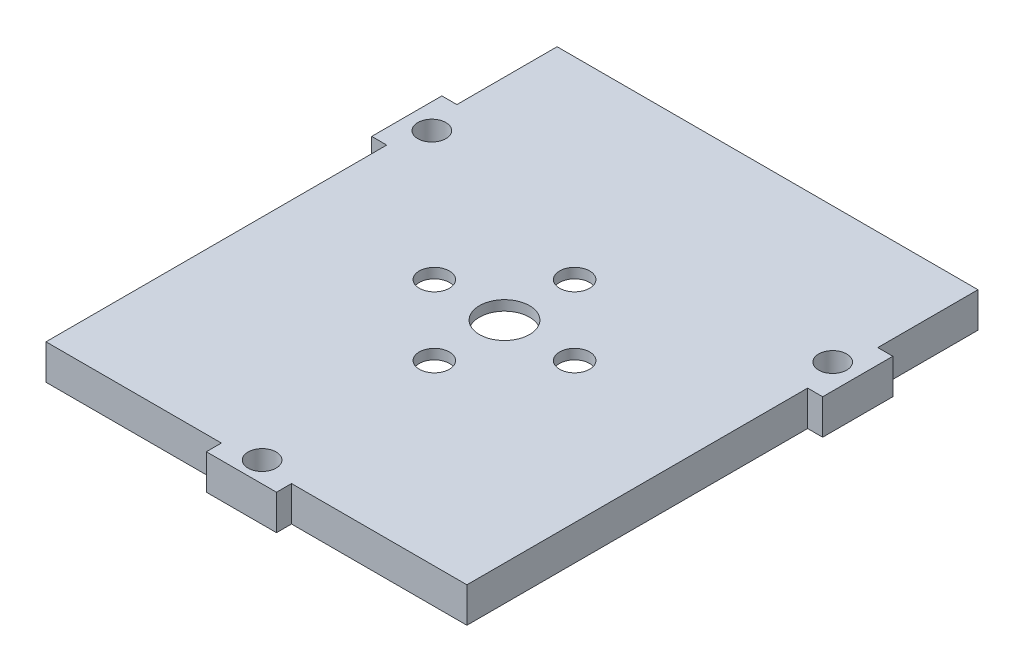
ISO-10303-21;
HEADER;
FILE_DESCRIPTION(('STEP AP214'),'2;1');
FILE_NAME('part.step','',(''),(''),'','','');
FILE_SCHEMA(('AUTOMOTIVE_DESIGN { 1 0 10303 214 1 1 1 1 }'));
ENDSEC;
DATA;
#1=APPLICATION_CONTEXT('core data for automotive mechanical design processes');
#2=APPLICATION_PROTOCOL_DEFINITION('international standard','automotive_design',2000,#1);
#3=PRODUCT_CONTEXT('',#1,'mechanical');
#4=PRODUCT('Part','Part','',(#3));
#5=PRODUCT_RELATED_PRODUCT_CATEGORY('part','',(#4));
#6=PRODUCT_DEFINITION_FORMATION('','',#4);
#7=PRODUCT_DEFINITION_CONTEXT('part definition',#1,'design');
#8=PRODUCT_DEFINITION('design','',#6,#7);
#9=PRODUCT_DEFINITION_SHAPE('','',#8);
#10=(LENGTH_UNIT() NAMED_UNIT(*) SI_UNIT(.MILLI.,.METRE.));
#11=(NAMED_UNIT(*) PLANE_ANGLE_UNIT() SI_UNIT($,.RADIAN.));
#12=(NAMED_UNIT(*) SI_UNIT($,.STERADIAN.) SOLID_ANGLE_UNIT());
#13=UNCERTAINTY_MEASURE_WITH_UNIT(LENGTH_MEASURE(1.E-05),#10,'distance_accuracy_value','');
#14=(GEOMETRIC_REPRESENTATION_CONTEXT(3) GLOBAL_UNCERTAINTY_ASSIGNED_CONTEXT((#13)) GLOBAL_UNIT_ASSIGNED_CONTEXT((#10,
#11,#12)) REPRESENTATION_CONTEXT('',''));
#15=CARTESIAN_POINT('',(0.,0.,0.));
#16=DIRECTION('',(0.,0.,1.));
#17=DIRECTION('',(1.,0.,0.));
#18=AXIS2_PLACEMENT_3D('',#15,#16,#17);
#19=CARTESIAN_POINT('',(0.,1.,0.750000000000001));
#20=DIRECTION('',(0.,1.,0.));
#21=DIRECTION('',(0.,0.,-1.));
#22=AXIS2_PLACEMENT_3D('',#19,#20,#21);
#23=CYLINDRICAL_SURFACE('',#22,2.5);
#24=CARTESIAN_POINT('',(0.,3.5,0.750000000000001));
#25=DIRECTION('',(0.,-1.,0.));
#26=DIRECTION('',(0.,0.,-1.));
#27=AXIS2_PLACEMENT_3D('',#24,#25,#26);
#28=CIRCLE('',#27,2.5);
#29=CARTESIAN_POINT('',(0.,3.5,-1.75));
#30=VERTEX_POINT('',#29);
#31=EDGE_CURVE('E243',#30,#30,#28,.T.);
#32=ORIENTED_EDGE('',*,*,#31,.F.);
#33=EDGE_LOOP('',(#32));
#34=FACE_BOUND('',#33,.T.);
#35=CARTESIAN_POINT('',(0.,2.5,0.750000000000001));
#36=DIRECTION('',(0.,1.,0.));
#37=DIRECTION('',(0.,0.,1.));
#38=AXIS2_PLACEMENT_3D('',#35,#36,#37);
#39=CIRCLE('',#38,2.5);
#40=CARTESIAN_POINT('',(0.,2.5,3.25));
#41=VERTEX_POINT('',#40);
#42=EDGE_CURVE('E230',#41,#41,#39,.F.);
#43=ORIENTED_EDGE('',*,*,#42,.T.);
#44=EDGE_LOOP('',(#43));
#45=FACE_BOUND('',#44,.T.);
#46=ADVANCED_FACE('F43',(#34,#45),#23,.F.);
#47=CARTESIAN_POINT('',(0.,1.,-6.25));
#48=DIRECTION('',(0.,1.,0.));
#49=DIRECTION('',(0.,0.,-1.));
#50=AXIS2_PLACEMENT_3D('',#47,#48,#49);
#51=CYLINDRICAL_SURFACE('',#50,1.5);
#52=CARTESIAN_POINT('',(0.,3.5,-6.25));
#53=DIRECTION('',(0.,-1.,0.));
#54=DIRECTION('',(0.,0.,1.));
#55=AXIS2_PLACEMENT_3D('',#52,#53,#54);
#56=CIRCLE('',#55,1.5);
#57=CARTESIAN_POINT('',(0.,3.5,-4.75));
#58=VERTEX_POINT('',#57);
#59=EDGE_CURVE('E233',#58,#58,#56,.T.);
#60=ORIENTED_EDGE('',*,*,#59,.F.);
#61=EDGE_LOOP('',(#60));
#62=FACE_BOUND('',#61,.T.);
#63=CARTESIAN_POINT('',(0.,2.5,-6.25));
#64=DIRECTION('',(0.,1.,0.));
#65=DIRECTION('',(0.,0.,1.));
#66=AXIS2_PLACEMENT_3D('',#63,#64,#65);
#67=CIRCLE('',#66,1.5);
#68=CARTESIAN_POINT('',(0.,2.5,-4.75));
#69=VERTEX_POINT('',#68);
#70=EDGE_CURVE('E227',#69,#69,#67,.F.);
#71=ORIENTED_EDGE('',*,*,#70,.T.);
#72=EDGE_LOOP('',(#71));
#73=FACE_BOUND('',#72,.T.);
#74=ADVANCED_FACE('F408',(#62,#73),#51,.F.);
#75=CARTESIAN_POINT('',(7.,1.,0.750000000000004));
#76=DIRECTION('',(0.,1.,0.));
#77=DIRECTION('',(0.,0.,-1.));
#78=AXIS2_PLACEMENT_3D('',#75,#76,#77);
#79=CYLINDRICAL_SURFACE('',#78,1.5);
#80=CARTESIAN_POINT('',(7.,3.5,0.750000000000004));
#81=DIRECTION('',(0.,-1.,0.));
#82=DIRECTION('',(0.,0.,1.));
#83=AXIS2_PLACEMENT_3D('',#80,#81,#82);
#84=CIRCLE('',#83,1.5);
#85=CARTESIAN_POINT('',(7.,3.5,2.25));
#86=VERTEX_POINT('',#85);
#87=EDGE_CURVE('E234',#86,#86,#84,.T.);
#88=ORIENTED_EDGE('',*,*,#87,.F.);
#89=EDGE_LOOP('',(#88));
#90=FACE_BOUND('',#89,.T.);
#91=CARTESIAN_POINT('',(7.,2.5,0.750000000000004));
#92=DIRECTION('',(0.,1.,0.));
#93=DIRECTION('',(0.,0.,1.));
#94=AXIS2_PLACEMENT_3D('',#91,#92,#93);
#95=CIRCLE('',#94,1.5);
#96=CARTESIAN_POINT('',(7.,2.5,2.25));
#97=VERTEX_POINT('',#96);
#98=EDGE_CURVE('E224',#97,#97,#95,.F.);
#99=ORIENTED_EDGE('',*,*,#98,.T.);
#100=EDGE_LOOP('',(#99));
#101=FACE_BOUND('',#100,.T.);
#102=ADVANCED_FACE('F414',(#90,#101),#79,.F.);
#103=CARTESIAN_POINT('',(0.,1.,7.75));
#104=DIRECTION('',(0.,1.,0.));
#105=DIRECTION('',(0.,0.,-1.));
#106=AXIS2_PLACEMENT_3D('',#103,#104,#105);
#107=CYLINDRICAL_SURFACE('',#106,1.5);
#108=CARTESIAN_POINT('',(0.,3.5,7.75));
#109=DIRECTION('',(0.,-1.,0.));
#110=DIRECTION('',(0.,0.,-1.));
#111=AXIS2_PLACEMENT_3D('',#108,#109,#110);
#112=CIRCLE('',#111,1.5);
#113=CARTESIAN_POINT('',(0.,3.5,6.25));
#114=VERTEX_POINT('',#113);
#115=EDGE_CURVE('E237',#114,#114,#112,.T.);
#116=ORIENTED_EDGE('',*,*,#115,.F.);
#117=EDGE_LOOP('',(#116));
#118=FACE_BOUND('',#117,.T.);
#119=CARTESIAN_POINT('',(0.,2.5,7.75));
#120=DIRECTION('',(0.,1.,0.));
#121=DIRECTION('',(0.,0.,1.));
#122=AXIS2_PLACEMENT_3D('',#119,#120,#121);
#123=CIRCLE('',#122,1.5);
#124=CARTESIAN_POINT('',(0.,2.5,9.25));
#125=VERTEX_POINT('',#124);
#126=EDGE_CURVE('E221',#125,#125,#123,.F.);
#127=ORIENTED_EDGE('',*,*,#126,.T.);
#128=EDGE_LOOP('',(#127));
#129=FACE_BOUND('',#128,.T.);
#130=ADVANCED_FACE('F420',(#118,#129),#107,.F.);
#131=CARTESIAN_POINT('',(-7.,1.,0.750000000000002));
#132=DIRECTION('',(0.,1.,0.));
#133=DIRECTION('',(0.,0.,-1.));
#134=AXIS2_PLACEMENT_3D('',#131,#132,#133);
#135=CYLINDRICAL_SURFACE('',#134,1.5);
#136=CARTESIAN_POINT('',(-7.,3.5,0.750000000000002));
#137=DIRECTION('',(0.,-1.,0.));
#138=DIRECTION('',(0.,0.,-1.));
#139=AXIS2_PLACEMENT_3D('',#136,#137,#138);
#140=CIRCLE('',#139,1.5);
#141=CARTESIAN_POINT('',(-7.,3.5,-0.749999999999997));
#142=VERTEX_POINT('',#141);
#143=EDGE_CURVE('E240',#142,#142,#140,.T.);
#144=ORIENTED_EDGE('',*,*,#143,.F.);
#145=EDGE_LOOP('',(#144));
#146=FACE_BOUND('',#145,.T.);
#147=CARTESIAN_POINT('',(-7.,2.5,0.750000000000002));
#148=DIRECTION('',(0.,1.,0.));
#149=DIRECTION('',(0.,0.,1.));
#150=AXIS2_PLACEMENT_3D('',#147,#148,#149);
#151=CIRCLE('',#150,1.5);
#152=CARTESIAN_POINT('',(-7.,2.5,2.25));
#153=VERTEX_POINT('',#152);
#154=EDGE_CURVE('E47',#153,#153,#151,.F.);
#155=ORIENTED_EDGE('',*,*,#154,.T.);
#156=EDGE_LOOP('',(#155));
#157=FACE_BOUND('',#156,.T.);
#158=ADVANCED_FACE('F423',(#146,#157),#135,.F.);
#159=CARTESIAN_POINT('',(0.,3.5,0.));
#160=DIRECTION('',(0.,1.,0.));
#161=DIRECTION('',(0.,0.,-1.));
#162=AXIS2_PLACEMENT_3D('',#159,#160,#161);
#163=PLANE('',#162);
#164=ORIENTED_EDGE('',*,*,#143,.T.);
#165=EDGE_LOOP('',(#164));
#166=FACE_BOUND('',#165,.T.);
#167=ORIENTED_EDGE('',*,*,#115,.T.);
#168=EDGE_LOOP('',(#167));
#169=FACE_BOUND('',#168,.T.);
#170=ORIENTED_EDGE('',*,*,#87,.T.);
#171=EDGE_LOOP('',(#170));
#172=FACE_BOUND('',#171,.T.);
#173=ORIENTED_EDGE('',*,*,#59,.T.);
#174=EDGE_LOOP('',(#173));
#175=FACE_BOUND('',#174,.T.);
#176=ORIENTED_EDGE('',*,*,#31,.T.);
#177=EDGE_LOOP('',(#176));
#178=FACE_BOUND('',#177,.T.);
#179=CARTESIAN_POINT('',(-20.,3.5,-12.));
#180=DIRECTION('',(0.,-1.,0.));
#181=DIRECTION('',(0.,0.,-1.));
#182=AXIS2_PLACEMENT_3D('',#179,#180,#181);
#183=CIRCLE('',#182,1.4);
#184=CARTESIAN_POINT('',(-20.,3.5,-13.4));
#185=VERTEX_POINT('',#184);
#186=EDGE_CURVE('E249',#185,#185,#183,.T.);
#187=ORIENTED_EDGE('',*,*,#186,.T.);
#188=EDGE_LOOP('',(#187));
#189=FACE_BOUND('',#188,.T.);
#190=DIRECTION('',(0.,0.,-1.));
#191=VECTOR('',#190,1.);
#192=CARTESIAN_POINT('',(21.,3.5,0.));
#193=LINE('',#192,#191);
#194=CARTESIAN_POINT('',(21.,3.5,25.5));
#195=VERTEX_POINT('',#194);
#196=CARTESIAN_POINT('',(21.,3.5,-8.5));
#197=VERTEX_POINT('',#196);
#198=EDGE_CURVE('E336',#195,#197,#193,.T.);
#199=ORIENTED_EDGE('',*,*,#198,.T.);
#200=DIRECTION('',(-1.,0.,0.));
#201=VECTOR('',#200,1.);
#202=CARTESIAN_POINT('',(22.5,3.5,-8.5));
#203=LINE('',#202,#201);
#204=CARTESIAN_POINT('',(22.5,3.5,-8.5));
#205=VERTEX_POINT('',#204);
#206=EDGE_CURVE('E306',#205,#197,#203,.T.);
#207=ORIENTED_EDGE('',*,*,#206,.F.);
#208=DIRECTION('',(0.,0.,-1.));
#209=VECTOR('',#208,1.);
#210=CARTESIAN_POINT('',(22.5,3.5,-8.5));
#211=LINE('',#210,#209);
#212=CARTESIAN_POINT('',(22.5,3.5,-15.5));
#213=VERTEX_POINT('',#212);
#214=EDGE_CURVE('E286',#205,#213,#211,.T.);
#215=ORIENTED_EDGE('',*,*,#214,.T.);
#216=DIRECTION('',(-1.,0.,0.));
#217=VECTOR('',#216,1.);
#218=CARTESIAN_POINT('',(22.5,3.5,-15.5));
#219=LINE('',#218,#217);
#220=CARTESIAN_POINT('',(21.,3.5,-15.5));
#221=VERTEX_POINT('',#220);
#222=EDGE_CURVE('E303',#213,#221,#219,.T.);
#223=ORIENTED_EDGE('',*,*,#222,.T.);
#224=CARTESIAN_POINT('',(21.,3.5,-25.5));
#225=VERTEX_POINT('',#224);
#226=EDGE_CURVE('E340',#221,#225,#193,.T.);
#227=ORIENTED_EDGE('',*,*,#226,.T.);
#228=DIRECTION('',(1.,0.,0.));
#229=VECTOR('',#228,1.);
#230=CARTESIAN_POINT('',(0.,3.5,-25.5));
#231=LINE('',#230,#229);
#232=CARTESIAN_POINT('',(-21.,3.5,-25.5));
#233=VERTEX_POINT('',#232);
#234=EDGE_CURVE('E348',#233,#225,#231,.T.);
#235=ORIENTED_EDGE('',*,*,#234,.F.);
#236=DIRECTION('',(0.,0.,-1.));
#237=VECTOR('',#236,1.);
#238=CARTESIAN_POINT('',(-21.,3.5,0.));
#239=LINE('',#238,#237);
#240=CARTESIAN_POINT('',(-21.,3.5,-15.5));
#241=VERTEX_POINT('',#240);
#242=EDGE_CURVE('E344',#241,#233,#239,.T.);
#243=ORIENTED_EDGE('',*,*,#242,.F.);
#244=DIRECTION('',(1.,0.,0.));
#245=VECTOR('',#244,1.);
#246=CARTESIAN_POINT('',(-22.5,3.5,-15.5));
#247=LINE('',#246,#245);
#248=CARTESIAN_POINT('',(-22.5,3.5,-15.5));
#249=VERTEX_POINT('',#248);
#250=EDGE_CURVE('E332',#249,#241,#247,.T.);
#251=ORIENTED_EDGE('',*,*,#250,.F.);
#252=DIRECTION('',(0.,0.,1.));
#253=VECTOR('',#252,1.);
#254=CARTESIAN_POINT('',(-22.5,3.5,-15.5));
#255=LINE('',#254,#253);
#256=CARTESIAN_POINT('',(-22.5,3.5,-8.5));
#257=VERTEX_POINT('',#256);
#258=EDGE_CURVE('E312',#249,#257,#255,.T.);
#259=ORIENTED_EDGE('',*,*,#258,.T.);
#260=DIRECTION('',(1.,0.,0.));
#261=VECTOR('',#260,1.);
#262=CARTESIAN_POINT('',(-22.5,3.5,-8.5));
#263=LINE('',#262,#261);
#264=CARTESIAN_POINT('',(-21.,3.5,-8.5));
#265=VERTEX_POINT('',#264);
#266=EDGE_CURVE('E329',#257,#265,#263,.T.);
#267=ORIENTED_EDGE('',*,*,#266,.T.);
#268=CARTESIAN_POINT('',(-21.,3.5,25.5));
#269=VERTEX_POINT('',#268);
#270=EDGE_CURVE('E345',#269,#265,#239,.T.);
#271=ORIENTED_EDGE('',*,*,#270,.F.);
#272=DIRECTION('',(1.,0.,0.));
#273=VECTOR('',#272,1.);
#274=CARTESIAN_POINT('',(0.,3.5,25.5));
#275=LINE('',#274,#273);
#276=CARTESIAN_POINT('',(-3.5,3.5,25.5));
#277=VERTEX_POINT('',#276);
#278=EDGE_CURVE('E341',#269,#277,#275,.T.);
#279=ORIENTED_EDGE('',*,*,#278,.T.);
#280=DIRECTION('',(0.,0.,-1.));
#281=VECTOR('',#280,1.);
#282=CARTESIAN_POINT('',(-3.5,3.5,27.));
#283=LINE('',#282,#281);
#284=CARTESIAN_POINT('',(-3.5,3.5,27.));
#285=VERTEX_POINT('',#284);
#286=EDGE_CURVE('E275',#285,#277,#283,.T.);
#287=ORIENTED_EDGE('',*,*,#286,.F.);
#288=DIRECTION('',(1.,0.,0.));
#289=VECTOR('',#288,1.);
#290=CARTESIAN_POINT('',(3.5,3.5,27.));
#291=LINE('',#290,#289);
#292=CARTESIAN_POINT('',(3.5,3.5,27.));
#293=VERTEX_POINT('',#292);
#294=EDGE_CURVE('E266',#285,#293,#291,.T.);
#295=ORIENTED_EDGE('',*,*,#294,.T.);
#296=DIRECTION('',(0.,0.,-1.));
#297=VECTOR('',#296,1.);
#298=CARTESIAN_POINT('',(3.5,3.5,27.));
#299=LINE('',#298,#297);
#300=CARTESIAN_POINT('',(3.5,3.5,25.5));
#301=VERTEX_POINT('',#300);
#302=EDGE_CURVE('E269',#293,#301,#299,.T.);
#303=ORIENTED_EDGE('',*,*,#302,.T.);
#304=EDGE_CURVE('E339',#301,#195,#275,.T.);
#305=ORIENTED_EDGE('',*,*,#304,.T.);
#306=EDGE_LOOP('',(#199,#207,#215,#223,#227,#235,#243,#251,#259,#267,#271,#279,#287,#295,#303,#305));
#307=FACE_BOUND('',#306,.T.);
#308=CARTESIAN_POINT('',(0.,3.5,24.9375));
#309=DIRECTION('',(0.,-1.,0.));
#310=DIRECTION('',(0.,0.,-1.));
#311=AXIS2_PLACEMENT_3D('',#308,#309,#310);
#312=CIRCLE('',#311,1.4);
#313=CARTESIAN_POINT('',(0.,3.5,23.5375));
#314=VERTEX_POINT('',#313);
#315=EDGE_CURVE('E248',#314,#314,#312,.T.);
#316=ORIENTED_EDGE('',*,*,#315,.T.);
#317=EDGE_LOOP('',(#316));
#318=FACE_BOUND('',#317,.T.);
#319=CARTESIAN_POINT('',(20.,3.5,-12.));
#320=DIRECTION('',(0.,-1.,0.));
#321=DIRECTION('',(0.,0.,-1.));
#322=AXIS2_PLACEMENT_3D('',#319,#320,#321);
#323=CIRCLE('',#322,1.4);
#324=CARTESIAN_POINT('',(20.,3.5,-13.4));
#325=VERTEX_POINT('',#324);
#326=EDGE_CURVE('E253',#325,#325,#323,.F.);
#327=ORIENTED_EDGE('',*,*,#326,.F.);
#328=EDGE_LOOP('',(#327));
#329=FACE_BOUND('',#328,.T.);
#330=ADVANCED_FACE('F383',(#166,#169,#172,#175,#178,#189,#307,#318,#329),#163,.T.);
#331=CARTESIAN_POINT('',(0.,0.,0.));
#332=DIRECTION('',(0.,1.,0.));
#333=DIRECTION('',(0.,0.,-1.));
#334=AXIS2_PLACEMENT_3D('',#331,#332,#333);
#335=PLANE('',#334);
#336=DIRECTION('',(1.,0.,0.));
#337=VECTOR('',#336,1.);
#338=CARTESIAN_POINT('',(-12.5,0.,13.25));
#339=LINE('',#338,#337);
#340=CARTESIAN_POINT('',(-12.5,0.,13.25));
#341=VERTEX_POINT('',#340);
#342=CARTESIAN_POINT('',(12.5,0.,13.25));
#343=VERTEX_POINT('',#342);
#344=EDGE_CURVE('E188',#341,#343,#339,.T.);
#345=ORIENTED_EDGE('',*,*,#344,.T.);
#346=DIRECTION('',(0.,0.,-1.));
#347=VECTOR('',#346,1.);
#348=CARTESIAN_POINT('',(12.5,0.,-11.75));
#349=LINE('',#348,#347);
#350=CARTESIAN_POINT('',(12.5,0.,-11.75));
#351=VERTEX_POINT('',#350);
#352=EDGE_CURVE('E207',#343,#351,#349,.T.);
#353=ORIENTED_EDGE('',*,*,#352,.T.);
#354=DIRECTION('',(-1.,0.,0.));
#355=VECTOR('',#354,1.);
#356=CARTESIAN_POINT('',(-12.5,0.,-11.75));
#357=LINE('',#356,#355);
#358=CARTESIAN_POINT('',(-12.5,0.,-11.75));
#359=VERTEX_POINT('',#358);
#360=EDGE_CURVE('E204',#351,#359,#357,.T.);
#361=ORIENTED_EDGE('',*,*,#360,.T.);
#362=DIRECTION('',(0.,0.,1.));
#363=VECTOR('',#362,1.);
#364=CARTESIAN_POINT('',(-12.5,0.,-11.75));
#365=LINE('',#364,#363);
#366=EDGE_CURVE('E212',#359,#341,#365,.T.);
#367=ORIENTED_EDGE('',*,*,#366,.T.);
#368=EDGE_LOOP('',(#345,#353,#361,#367));
#369=FACE_BOUND('',#368,.T.);
#370=CARTESIAN_POINT('',(-20.,0.,-12.));
#371=DIRECTION('',(0.,-1.,0.));
#372=DIRECTION('',(0.,0.,-1.));
#373=AXIS2_PLACEMENT_3D('',#370,#371,#372);
#374=CIRCLE('',#373,1.4);
#375=CARTESIAN_POINT('',(-20.,0.,-13.4));
#376=VERTEX_POINT('',#375);
#377=EDGE_CURVE('E271',#376,#376,#374,.T.);
#378=ORIENTED_EDGE('',*,*,#377,.F.);
#379=EDGE_LOOP('',(#378));
#380=FACE_BOUND('',#379,.T.);
#381=CARTESIAN_POINT('',(0.,0.,24.9375));
#382=DIRECTION('',(0.,-1.,0.));
#383=DIRECTION('',(0.,0.,-1.));
#384=AXIS2_PLACEMENT_3D('',#381,#382,#383);
#385=CIRCLE('',#384,1.4);
#386=CARTESIAN_POINT('',(0.,0.,23.5375));
#387=VERTEX_POINT('',#386);
#388=EDGE_CURVE('E252',#387,#387,#385,.T.);
#389=ORIENTED_EDGE('',*,*,#388,.F.);
#390=EDGE_LOOP('',(#389));
#391=FACE_BOUND('',#390,.T.);
#392=DIRECTION('',(0.,0.,-1.));
#393=VECTOR('',#392,1.);
#394=CARTESIAN_POINT('',(21.,0.,0.));
#395=LINE('',#394,#393);
#396=CARTESIAN_POINT('',(21.,0.,25.5));
#397=VERTEX_POINT('',#396);
#398=CARTESIAN_POINT('',(21.,0.,-8.5));
#399=VERTEX_POINT('',#398);
#400=EDGE_CURVE('E352',#397,#399,#395,.T.);
#401=ORIENTED_EDGE('',*,*,#400,.F.);
#402=DIRECTION('',(1.,0.,0.));
#403=VECTOR('',#402,1.);
#404=CARTESIAN_POINT('',(0.,0.,25.5));
#405=LINE('',#404,#403);
#406=CARTESIAN_POINT('',(3.5,0.,25.5));
#407=VERTEX_POINT('',#406);
#408=EDGE_CURVE('E355',#407,#397,#405,.T.);
#409=ORIENTED_EDGE('',*,*,#408,.F.);
#410=DIRECTION('',(0.,0.,-1.));
#411=VECTOR('',#410,1.);
#412=CARTESIAN_POINT('',(3.5,0.,27.));
#413=LINE('',#412,#411);
#414=CARTESIAN_POINT('',(3.5,0.,27.));
#415=VERTEX_POINT('',#414);
#416=EDGE_CURVE('E281',#415,#407,#413,.T.);
#417=ORIENTED_EDGE('',*,*,#416,.F.);
#418=DIRECTION('',(-1.,0.,0.));
#419=VECTOR('',#418,1.);
#420=CARTESIAN_POINT('',(3.5,0.,27.));
#421=LINE('',#420,#419);
#422=CARTESIAN_POINT('',(-3.5,0.,27.));
#423=VERTEX_POINT('',#422);
#424=EDGE_CURVE('E260',#415,#423,#421,.T.);
#425=ORIENTED_EDGE('',*,*,#424,.T.);
#426=DIRECTION('',(0.,0.,-1.));
#427=VECTOR('',#426,1.);
#428=CARTESIAN_POINT('',(-3.5,0.,27.));
#429=LINE('',#428,#427);
#430=CARTESIAN_POINT('',(-3.5,0.,25.5));
#431=VERTEX_POINT('',#430);
#432=EDGE_CURVE('E278',#423,#431,#429,.T.);
#433=ORIENTED_EDGE('',*,*,#432,.T.);
#434=CARTESIAN_POINT('',(-21.,0.,25.5));
#435=VERTEX_POINT('',#434);
#436=EDGE_CURVE('E356',#435,#431,#405,.T.);
#437=ORIENTED_EDGE('',*,*,#436,.F.);
#438=DIRECTION('',(0.,0.,-1.));
#439=VECTOR('',#438,1.);
#440=CARTESIAN_POINT('',(-21.,0.,0.));
#441=LINE('',#440,#439);
#442=CARTESIAN_POINT('',(-21.,0.,-8.5));
#443=VERTEX_POINT('',#442);
#444=EDGE_CURVE('E360',#435,#443,#441,.T.);
#445=ORIENTED_EDGE('',*,*,#444,.T.);
#446=DIRECTION('',(1.,0.,0.));
#447=VECTOR('',#446,1.);
#448=CARTESIAN_POINT('',(-22.5,0.,-8.5));
#449=LINE('',#448,#447);
#450=CARTESIAN_POINT('',(-22.5,0.,-8.5));
#451=VERTEX_POINT('',#450);
#452=EDGE_CURVE('E326',#451,#443,#449,.T.);
#453=ORIENTED_EDGE('',*,*,#452,.F.);
#454=DIRECTION('',(0.,0.,-1.));
#455=VECTOR('',#454,1.);
#456=CARTESIAN_POINT('',(-22.5,0.,-15.5));
#457=LINE('',#456,#455);
#458=CARTESIAN_POINT('',(-22.5,0.,-15.5));
#459=VERTEX_POINT('',#458);
#460=EDGE_CURVE('E318',#451,#459,#457,.T.);
#461=ORIENTED_EDGE('',*,*,#460,.T.);
#462=DIRECTION('',(1.,0.,0.));
#463=VECTOR('',#462,1.);
#464=CARTESIAN_POINT('',(-22.5,0.,-15.5));
#465=LINE('',#464,#463);
#466=CARTESIAN_POINT('',(-21.,0.,-15.5));
#467=VERTEX_POINT('',#466);
#468=EDGE_CURVE('E321',#459,#467,#465,.T.);
#469=ORIENTED_EDGE('',*,*,#468,.T.);
#470=CARTESIAN_POINT('',(-21.,0.,-25.5));
#471=VERTEX_POINT('',#470);
#472=EDGE_CURVE('E359',#467,#471,#441,.T.);
#473=ORIENTED_EDGE('',*,*,#472,.T.);
#474=DIRECTION('',(1.,0.,0.));
#475=VECTOR('',#474,1.);
#476=CARTESIAN_POINT('',(0.,0.,-25.5));
#477=LINE('',#476,#475);
#478=CARTESIAN_POINT('',(21.,0.,-25.5));
#479=VERTEX_POINT('',#478);
#480=EDGE_CURVE('E363',#471,#479,#477,.T.);
#481=ORIENTED_EDGE('',*,*,#480,.T.);
#482=CARTESIAN_POINT('',(21.,0.,-15.5));
#483=VERTEX_POINT('',#482);
#484=EDGE_CURVE('E335',#483,#479,#395,.T.);
#485=ORIENTED_EDGE('',*,*,#484,.F.);
#486=DIRECTION('',(-1.,0.,0.));
#487=VECTOR('',#486,1.);
#488=CARTESIAN_POINT('',(22.5,0.,-15.5));
#489=LINE('',#488,#487);
#490=CARTESIAN_POINT('',(22.5,0.,-15.5));
#491=VERTEX_POINT('',#490);
#492=EDGE_CURVE('E300',#491,#483,#489,.T.);
#493=ORIENTED_EDGE('',*,*,#492,.F.);
#494=DIRECTION('',(0.,0.,1.));
#495=VECTOR('',#494,1.);
#496=CARTESIAN_POINT('',(22.5,0.,-8.5));
#497=LINE('',#496,#495);
#498=CARTESIAN_POINT('',(22.5,0.,-8.5));
#499=VERTEX_POINT('',#498);
#500=EDGE_CURVE('E292',#491,#499,#497,.T.);
#501=ORIENTED_EDGE('',*,*,#500,.T.);
#502=DIRECTION('',(-1.,0.,0.));
#503=VECTOR('',#502,1.);
#504=CARTESIAN_POINT('',(22.5,0.,-8.5));
#505=LINE('',#504,#503);
#506=EDGE_CURVE('E295',#499,#399,#505,.T.);
#507=ORIENTED_EDGE('',*,*,#506,.T.);
#508=EDGE_LOOP('',(#401,#409,#417,#425,#433,#437,#445,#453,#461,#469,#473,#481,#485,#493,#501,#507));
#509=FACE_BOUND('',#508,.T.);
#510=CARTESIAN_POINT('',(20.,0.,-12.));
#511=DIRECTION('',(0.,-1.,0.));
#512=DIRECTION('',(0.,0.,-1.));
#513=AXIS2_PLACEMENT_3D('',#510,#511,#512);
#514=CIRCLE('',#513,1.4);
#515=CARTESIAN_POINT('',(20.,0.,-13.4));
#516=VERTEX_POINT('',#515);
#517=EDGE_CURVE('E372',#516,#516,#514,.F.);
#518=ORIENTED_EDGE('',*,*,#517,.T.);
#519=EDGE_LOOP('',(#518));
#520=FACE_BOUND('',#519,.T.);
#521=ADVANCED_FACE('F379',(#369,#380,#391,#509,#520),#335,.F.);
#522=CARTESIAN_POINT('',(0.,3.5,25.5));
#523=DIRECTION('',(0.,0.,1.));
#524=DIRECTION('',(-1.,0.,0.));
#525=AXIS2_PLACEMENT_3D('',#522,#523,#524);
#526=PLANE('',#525);
#527=DIRECTION('',(0.,-1.,0.));
#528=VECTOR('',#527,1.);
#529=CARTESIAN_POINT('',(3.5,3.5,25.5));
#530=LINE('',#529,#528);
#531=EDGE_CURVE('E68',#301,#407,#530,.T.);
#532=ORIENTED_EDGE('',*,*,#531,.T.);
#533=ORIENTED_EDGE('',*,*,#408,.T.);
#534=DIRECTION('',(0.,-1.,0.));
#535=VECTOR('',#534,1.);
#536=CARTESIAN_POINT('',(21.,3.5,25.5));
#537=LINE('',#536,#535);
#538=EDGE_CURVE('E11',#195,#397,#537,.T.);
#539=ORIENTED_EDGE('',*,*,#538,.F.);
#540=ORIENTED_EDGE('',*,*,#304,.F.);
#541=EDGE_LOOP('',(#532,#533,#539,#540));
#542=FACE_BOUND('',#541,.T.);
#543=ADVANCED_FACE('F382',(#542),#526,.T.);
#544=CARTESIAN_POINT('',(21.,3.5,0.));
#545=DIRECTION('',(1.,0.,0.));
#546=DIRECTION('',(0.,0.,1.));
#547=AXIS2_PLACEMENT_3D('',#544,#545,#546);
#548=PLANE('',#547);
#549=DIRECTION('',(0.,1.,0.));
#550=VECTOR('',#549,1.);
#551=CARTESIAN_POINT('',(21.,3.5,-8.5));
#552=LINE('',#551,#550);
#553=EDGE_CURVE('E283',#399,#197,#552,.T.);
#554=ORIENTED_EDGE('',*,*,#553,.T.);
#555=ORIENTED_EDGE('',*,*,#198,.F.);
#556=ORIENTED_EDGE('',*,*,#538,.T.);
#557=ORIENTED_EDGE('',*,*,#400,.T.);
#558=EDGE_LOOP('',(#554,#555,#556,#557));
#559=FACE_BOUND('',#558,.T.);
#560=ADVANCED_FACE('F488',(#559),#548,.T.);
#561=CARTESIAN_POINT('',(-21.,3.5,0.));
#562=DIRECTION('',(1.,0.,0.));
#563=DIRECTION('',(0.,0.,1.));
#564=AXIS2_PLACEMENT_3D('',#561,#562,#563);
#565=PLANE('',#564);
#566=DIRECTION('',(0.,1.,0.));
#567=VECTOR('',#566,1.);
#568=CARTESIAN_POINT('',(-21.,3.5,-15.5));
#569=LINE('',#568,#567);
#570=EDGE_CURVE('E309',#467,#241,#569,.T.);
#571=ORIENTED_EDGE('',*,*,#570,.T.);
#572=ORIENTED_EDGE('',*,*,#242,.T.);
#573=DIRECTION('',(0.,-1.,0.));
#574=VECTOR('',#573,1.);
#575=CARTESIAN_POINT('',(-21.,3.5,-25.5));
#576=LINE('',#575,#574);
#577=EDGE_CURVE('E367',#233,#471,#576,.T.);
#578=ORIENTED_EDGE('',*,*,#577,.T.);
#579=ORIENTED_EDGE('',*,*,#472,.F.);
#580=EDGE_LOOP('',(#571,#572,#578,#579));
#581=FACE_BOUND('',#580,.T.);
#582=ADVANCED_FACE('F517',(#581),#565,.F.);
#583=DIRECTION('',(0.,-1.,0.));
#584=VECTOR('',#583,1.);
#585=CARTESIAN_POINT('',(-21.,3.5,-8.5));
#586=LINE('',#585,#584);
#587=EDGE_CURVE('E313',#265,#443,#586,.T.);
#588=ORIENTED_EDGE('',*,*,#587,.T.);
#589=ORIENTED_EDGE('',*,*,#444,.F.);
#590=DIRECTION('',(0.,-1.,0.));
#591=VECTOR('',#590,1.);
#592=CARTESIAN_POINT('',(-21.,3.5,25.5));
#593=LINE('',#592,#591);
#594=EDGE_CURVE('E52',#269,#435,#593,.T.);
#595=ORIENTED_EDGE('',*,*,#594,.F.);
#596=ORIENTED_EDGE('',*,*,#270,.T.);
#597=EDGE_LOOP('',(#588,#589,#595,#596));
#598=FACE_BOUND('',#597,.T.);
#599=ADVANCED_FACE('F522',(#598),#565,.F.);
#600=DIRECTION('',(0.,-1.,0.));
#601=VECTOR('',#600,1.);
#602=CARTESIAN_POINT('',(21.,3.5,-15.5));
#603=LINE('',#602,#601);
#604=EDGE_CURVE('E287',#221,#483,#603,.T.);
#605=ORIENTED_EDGE('',*,*,#604,.T.);
#606=ORIENTED_EDGE('',*,*,#484,.T.);
#607=DIRECTION('',(0.,-1.,0.));
#608=VECTOR('',#607,1.);
#609=CARTESIAN_POINT('',(21.,3.5,-25.5));
#610=LINE('',#609,#608);
#611=EDGE_CURVE('E351',#225,#479,#610,.T.);
#612=ORIENTED_EDGE('',*,*,#611,.F.);
#613=ORIENTED_EDGE('',*,*,#226,.F.);
#614=EDGE_LOOP('',(#605,#606,#612,#613));
#615=FACE_BOUND('',#614,.T.);
#616=ADVANCED_FACE('F45',(#615),#548,.T.);
#617=DIRECTION('',(0.,1.,0.));
#618=VECTOR('',#617,1.);
#619=CARTESIAN_POINT('',(-3.5,3.5,25.5));
#620=LINE('',#619,#618);
#621=EDGE_CURVE('E261',#431,#277,#620,.T.);
#622=ORIENTED_EDGE('',*,*,#621,.T.);
#623=ORIENTED_EDGE('',*,*,#278,.F.);
#624=ORIENTED_EDGE('',*,*,#594,.T.);
#625=ORIENTED_EDGE('',*,*,#436,.T.);
#626=EDGE_LOOP('',(#622,#623,#624,#625));
#627=FACE_BOUND('',#626,.T.);
#628=ADVANCED_FACE('F490',(#627),#526,.T.);
#629=CARTESIAN_POINT('',(0.,3.5,-25.5));
#630=DIRECTION('',(0.,0.,1.));
#631=DIRECTION('',(-1.,0.,0.));
#632=AXIS2_PLACEMENT_3D('',#629,#630,#631);
#633=PLANE('',#632);
#634=ORIENTED_EDGE('',*,*,#480,.F.);
#635=ORIENTED_EDGE('',*,*,#577,.F.);
#636=ORIENTED_EDGE('',*,*,#234,.T.);
#637=ORIENTED_EDGE('',*,*,#611,.T.);
#638=EDGE_LOOP('',(#634,#635,#636,#637));
#639=FACE_BOUND('',#638,.T.);
#640=ADVANCED_FACE('F505',(#639),#633,.F.);
#641=CARTESIAN_POINT('',(-22.5,3.5,-15.5));
#642=DIRECTION('',(0.,0.,1.));
#643=DIRECTION('',(0.,1.,0.));
#644=AXIS2_PLACEMENT_3D('',#641,#642,#643);
#645=PLANE('',#644);
#646=ORIENTED_EDGE('',*,*,#570,.F.);
#647=ORIENTED_EDGE('',*,*,#468,.F.);
#648=DIRECTION('',(0.,1.,0.));
#649=VECTOR('',#648,1.);
#650=CARTESIAN_POINT('',(-22.5,3.5,-15.5));
#651=LINE('',#650,#649);
#652=EDGE_CURVE('E310',#459,#249,#651,.T.);
#653=ORIENTED_EDGE('',*,*,#652,.T.);
#654=ORIENTED_EDGE('',*,*,#250,.T.);
#655=EDGE_LOOP('',(#646,#647,#653,#654));
#656=FACE_BOUND('',#655,.T.);
#657=ADVANCED_FACE('F510',(#656),#645,.F.);
#658=CARTESIAN_POINT('',(-22.5,3.5,-8.5));
#659=DIRECTION('',(0.,0.,-1.));
#660=DIRECTION('',(1.,0.,0.));
#661=AXIS2_PLACEMENT_3D('',#658,#659,#660);
#662=PLANE('',#661);
#663=ORIENTED_EDGE('',*,*,#587,.F.);
#664=ORIENTED_EDGE('',*,*,#266,.F.);
#665=DIRECTION('',(0.,-1.,0.));
#666=VECTOR('',#665,1.);
#667=CARTESIAN_POINT('',(-22.5,3.5,-8.5));
#668=LINE('',#667,#666);
#669=EDGE_CURVE('E316',#257,#451,#668,.T.);
#670=ORIENTED_EDGE('',*,*,#669,.T.);
#671=ORIENTED_EDGE('',*,*,#452,.T.);
#672=EDGE_LOOP('',(#663,#664,#670,#671));
#673=FACE_BOUND('',#672,.T.);
#674=ADVANCED_FACE('F550',(#673),#662,.F.);
#675=CARTESIAN_POINT('',(-22.5,0.,0.));
#676=DIRECTION('',(1.,0.,0.));
#677=DIRECTION('',(0.,0.,1.));
#678=AXIS2_PLACEMENT_3D('',#675,#676,#677);
#679=PLANE('',#678);
#680=ORIENTED_EDGE('',*,*,#652,.F.);
#681=ORIENTED_EDGE('',*,*,#460,.F.);
#682=ORIENTED_EDGE('',*,*,#669,.F.);
#683=ORIENTED_EDGE('',*,*,#258,.F.);
#684=EDGE_LOOP('',(#680,#681,#682,#683));
#685=FACE_BOUND('',#684,.T.);
#686=ADVANCED_FACE('F559',(#685),#679,.F.);
#687=CARTESIAN_POINT('',(22.5,3.5,-8.5));
#688=DIRECTION('',(0.,0.,-1.));
#689=DIRECTION('',(1.,0.,0.));
#690=AXIS2_PLACEMENT_3D('',#687,#688,#689);
#691=PLANE('',#690);
#692=ORIENTED_EDGE('',*,*,#553,.F.);
#693=ORIENTED_EDGE('',*,*,#506,.F.);
#694=DIRECTION('',(0.,1.,0.));
#695=VECTOR('',#694,1.);
#696=CARTESIAN_POINT('',(22.5,3.5,-8.5));
#697=LINE('',#696,#695);
#698=EDGE_CURVE('E284',#499,#205,#697,.T.);
#699=ORIENTED_EDGE('',*,*,#698,.T.);
#700=ORIENTED_EDGE('',*,*,#206,.T.);
#701=EDGE_LOOP('',(#692,#693,#699,#700));
#702=FACE_BOUND('',#701,.T.);
#703=ADVANCED_FACE('F568',(#702),#691,.F.);
#704=CARTESIAN_POINT('',(22.5,3.5,-15.5));
#705=DIRECTION('',(0.,0.,1.));
#706=DIRECTION('',(0.,1.,0.));
#707=AXIS2_PLACEMENT_3D('',#704,#705,#706);
#708=PLANE('',#707);
#709=ORIENTED_EDGE('',*,*,#604,.F.);
#710=ORIENTED_EDGE('',*,*,#222,.F.);
#711=DIRECTION('',(0.,-1.,0.));
#712=VECTOR('',#711,1.);
#713=CARTESIAN_POINT('',(22.5,3.5,-15.5));
#714=LINE('',#713,#712);
#715=EDGE_CURVE('E290',#213,#491,#714,.T.);
#716=ORIENTED_EDGE('',*,*,#715,.T.);
#717=ORIENTED_EDGE('',*,*,#492,.T.);
#718=EDGE_LOOP('',(#709,#710,#716,#717));
#719=FACE_BOUND('',#718,.T.);
#720=ADVANCED_FACE('F583',(#719),#708,.F.);
#721=CARTESIAN_POINT('',(22.5,0.,0.));
#722=DIRECTION('',(-1.,0.,0.));
#723=DIRECTION('',(0.,0.,-1.));
#724=AXIS2_PLACEMENT_3D('',#721,#722,#723);
#725=PLANE('',#724);
#726=ORIENTED_EDGE('',*,*,#698,.F.);
#727=ORIENTED_EDGE('',*,*,#500,.F.);
#728=ORIENTED_EDGE('',*,*,#715,.F.);
#729=ORIENTED_EDGE('',*,*,#214,.F.);
#730=EDGE_LOOP('',(#726,#727,#728,#729));
#731=FACE_BOUND('',#730,.T.);
#732=ADVANCED_FACE('F592',(#731),#725,.F.);
#733=CARTESIAN_POINT('',(3.5,3.5,27.));
#734=DIRECTION('',(-1.,0.,0.));
#735=DIRECTION('',(0.,-1.,0.));
#736=AXIS2_PLACEMENT_3D('',#733,#734,#735);
#737=PLANE('',#736);
#738=ORIENTED_EDGE('',*,*,#531,.F.);
#739=ORIENTED_EDGE('',*,*,#302,.F.);
#740=DIRECTION('',(0.,-1.,0.));
#741=VECTOR('',#740,1.);
#742=CARTESIAN_POINT('',(3.5,3.5,27.));
#743=LINE('',#742,#741);
#744=EDGE_CURVE('E258',#293,#415,#743,.T.);
#745=ORIENTED_EDGE('',*,*,#744,.T.);
#746=ORIENTED_EDGE('',*,*,#416,.T.);
#747=EDGE_LOOP('',(#738,#739,#745,#746));
#748=FACE_BOUND('',#747,.T.);
#749=ADVANCED_FACE('F601',(#748),#737,.F.);
#750=CARTESIAN_POINT('',(-3.5,3.5,27.));
#751=DIRECTION('',(1.,0.,0.));
#752=DIRECTION('',(0.,1.,0.));
#753=AXIS2_PLACEMENT_3D('',#750,#751,#752);
#754=PLANE('',#753);
#755=ORIENTED_EDGE('',*,*,#621,.F.);
#756=ORIENTED_EDGE('',*,*,#432,.F.);
#757=DIRECTION('',(0.,1.,0.));
#758=VECTOR('',#757,1.);
#759=CARTESIAN_POINT('',(-3.5,3.5,27.));
#760=LINE('',#759,#758);
#761=EDGE_CURVE('E264',#423,#285,#760,.T.);
#762=ORIENTED_EDGE('',*,*,#761,.T.);
#763=ORIENTED_EDGE('',*,*,#286,.T.);
#764=EDGE_LOOP('',(#755,#756,#762,#763));
#765=FACE_BOUND('',#764,.T.);
#766=ADVANCED_FACE('F610',(#765),#754,.F.);
#767=CARTESIAN_POINT('',(0.,0.,27.));
#768=DIRECTION('',(0.,0.,1.));
#769=DIRECTION('',(-1.,0.,0.));
#770=AXIS2_PLACEMENT_3D('',#767,#768,#769);
#771=PLANE('',#770);
#772=ORIENTED_EDGE('',*,*,#744,.F.);
#773=ORIENTED_EDGE('',*,*,#294,.F.);
#774=ORIENTED_EDGE('',*,*,#761,.F.);
#775=ORIENTED_EDGE('',*,*,#424,.F.);
#776=EDGE_LOOP('',(#772,#773,#774,#775));
#777=FACE_BOUND('',#776,.T.);
#778=ADVANCED_FACE('F404',(#777),#771,.T.);
#779=CARTESIAN_POINT('',(0.,-1.5,24.9375));
#780=DIRECTION('',(0.,1.,0.));
#781=DIRECTION('',(0.,0.,-1.));
#782=AXIS2_PLACEMENT_3D('',#779,#780,#781);
#783=CYLINDRICAL_SURFACE('',#782,1.4);
#784=ORIENTED_EDGE('',*,*,#315,.F.);
#785=EDGE_LOOP('',(#784));
#786=FACE_BOUND('',#785,.T.);
#787=ORIENTED_EDGE('',*,*,#388,.T.);
#788=EDGE_LOOP('',(#787));
#789=FACE_BOUND('',#788,.T.);
#790=ADVANCED_FACE('F395',(#786,#789),#783,.F.);
#791=CARTESIAN_POINT('',(20.,-1.5,-12.));
#792=DIRECTION('',(0.,1.,0.));
#793=DIRECTION('',(0.,0.,-1.));
#794=AXIS2_PLACEMENT_3D('',#791,#792,#793);
#795=CYLINDRICAL_SURFACE('',#794,1.4);
#796=ORIENTED_EDGE('',*,*,#326,.T.);
#797=EDGE_LOOP('',(#796));
#798=FACE_BOUND('',#797,.T.);
#799=ORIENTED_EDGE('',*,*,#517,.F.);
#800=EDGE_LOOP('',(#799));
#801=FACE_BOUND('',#800,.T.);
#802=ADVANCED_FACE('F393',(#798,#801),#795,.F.);
#803=CARTESIAN_POINT('',(-20.,-1.5,-12.));
#804=DIRECTION('',(0.,1.,0.));
#805=DIRECTION('',(0.,0.,-1.));
#806=AXIS2_PLACEMENT_3D('',#803,#804,#805);
#807=CYLINDRICAL_SURFACE('',#806,1.4);
#808=ORIENTED_EDGE('',*,*,#186,.F.);
#809=EDGE_LOOP('',(#808));
#810=FACE_BOUND('',#809,.T.);
#811=ORIENTED_EDGE('',*,*,#377,.T.);
#812=EDGE_LOOP('',(#811));
#813=FACE_BOUND('',#812,.T.);
#814=ADVANCED_FACE('F377',(#810,#813),#807,.F.);
#815=CARTESIAN_POINT('',(0.,2.5,0.));
#816=DIRECTION('',(0.,-1.,0.));
#817=DIRECTION('',(0.,0.,1.));
#818=AXIS2_PLACEMENT_3D('',#815,#816,#817);
#819=PLANE('',#818);
#820=DIRECTION('',(0.,0.,1.));
#821=VECTOR('',#820,1.);
#822=CARTESIAN_POINT('',(-12.5,2.5,-11.75));
#823=LINE('',#822,#821);
#824=CARTESIAN_POINT('',(-12.5,2.5,-11.75));
#825=VERTEX_POINT('',#824);
#826=CARTESIAN_POINT('',(-12.5,2.5,13.25));
#827=VERTEX_POINT('',#826);
#828=EDGE_CURVE('E197',#825,#827,#823,.T.);
#829=ORIENTED_EDGE('',*,*,#828,.F.);
#830=DIRECTION('',(-1.,0.,0.));
#831=VECTOR('',#830,1.);
#832=CARTESIAN_POINT('',(-12.5,2.5,-11.75));
#833=LINE('',#832,#831);
#834=CARTESIAN_POINT('',(12.5,2.5,-11.75));
#835=VERTEX_POINT('',#834);
#836=EDGE_CURVE('E190',#835,#825,#833,.T.);
#837=ORIENTED_EDGE('',*,*,#836,.F.);
#838=DIRECTION('',(0.,0.,-1.));
#839=VECTOR('',#838,1.);
#840=CARTESIAN_POINT('',(12.5,2.5,-11.75));
#841=LINE('',#840,#839);
#842=CARTESIAN_POINT('',(12.5,2.5,13.25));
#843=VERTEX_POINT('',#842);
#844=EDGE_CURVE('E199',#843,#835,#841,.T.);
#845=ORIENTED_EDGE('',*,*,#844,.F.);
#846=DIRECTION('',(1.,0.,0.));
#847=VECTOR('',#846,1.);
#848=CARTESIAN_POINT('',(-12.5,2.5,13.25));
#849=LINE('',#848,#847);
#850=EDGE_CURVE('E185',#827,#843,#849,.T.);
#851=ORIENTED_EDGE('',*,*,#850,.F.);
#852=EDGE_LOOP('',(#829,#837,#845,#851));
#853=FACE_BOUND('',#852,.T.);
#854=ORIENTED_EDGE('',*,*,#154,.F.);
#855=EDGE_LOOP('',(#854));
#856=FACE_BOUND('',#855,.T.);
#857=ORIENTED_EDGE('',*,*,#126,.F.);
#858=EDGE_LOOP('',(#857));
#859=FACE_BOUND('',#858,.T.);
#860=ORIENTED_EDGE('',*,*,#98,.F.);
#861=EDGE_LOOP('',(#860));
#862=FACE_BOUND('',#861,.T.);
#863=ORIENTED_EDGE('',*,*,#70,.F.);
#864=EDGE_LOOP('',(#863));
#865=FACE_BOUND('',#864,.T.);
#866=ORIENTED_EDGE('',*,*,#42,.F.);
#867=EDGE_LOOP('',(#866));
#868=FACE_BOUND('',#867,.T.);
#869=ADVANCED_FACE('F194',(#853,#856,#859,#862,#865,#868),#819,.T.);
#870=CARTESIAN_POINT('',(-12.5,2.5,-11.75));
#871=DIRECTION('',(-1.,0.,0.));
#872=DIRECTION('',(0.,0.,-1.));
#873=AXIS2_PLACEMENT_3D('',#870,#871,#872);
#874=PLANE('',#873);
#875=ORIENTED_EDGE('',*,*,#366,.F.);
#876=DIRECTION('',(0.,-1.,0.));
#877=VECTOR('',#876,1.);
#878=CARTESIAN_POINT('',(-12.5,2.5,-11.75));
#879=LINE('',#878,#877);
#880=EDGE_CURVE('E202',#825,#359,#879,.T.);
#881=ORIENTED_EDGE('',*,*,#880,.F.);
#882=ORIENTED_EDGE('',*,*,#828,.T.);
#883=DIRECTION('',(0.,-1.,0.));
#884=VECTOR('',#883,1.);
#885=CARTESIAN_POINT('',(-12.5,2.5,13.25));
#886=LINE('',#885,#884);
#887=EDGE_CURVE('E60',#827,#341,#886,.T.);
#888=ORIENTED_EDGE('',*,*,#887,.T.);
#889=EDGE_LOOP('',(#875,#881,#882,#888));
#890=FACE_BOUND('',#889,.T.);
#891=ADVANCED_FACE('F201',(#890),#874,.F.);
#892=CARTESIAN_POINT('',(-12.5,2.5,-11.75));
#893=DIRECTION('',(0.,0.,-1.));
#894=DIRECTION('',(1.,0.,0.));
#895=AXIS2_PLACEMENT_3D('',#892,#893,#894);
#896=PLANE('',#895);
#897=ORIENTED_EDGE('',*,*,#360,.F.);
#898=DIRECTION('',(0.,-1.,0.));
#899=VECTOR('',#898,1.);
#900=CARTESIAN_POINT('',(12.5,2.5,-11.75));
#901=LINE('',#900,#899);
#902=EDGE_CURVE('E218',#835,#351,#901,.T.);
#903=ORIENTED_EDGE('',*,*,#902,.F.);
#904=ORIENTED_EDGE('',*,*,#836,.T.);
#905=ORIENTED_EDGE('',*,*,#880,.T.);
#906=EDGE_LOOP('',(#897,#903,#904,#905));
#907=FACE_BOUND('',#906,.T.);
#908=ADVANCED_FACE('F433',(#907),#896,.F.);
#909=CARTESIAN_POINT('',(12.5,2.5,-11.75));
#910=DIRECTION('',(1.,0.,0.));
#911=DIRECTION('',(0.,0.,1.));
#912=AXIS2_PLACEMENT_3D('',#909,#910,#911);
#913=PLANE('',#912);
#914=ORIENTED_EDGE('',*,*,#352,.F.);
#915=DIRECTION('',(0.,-1.,0.));
#916=VECTOR('',#915,1.);
#917=CARTESIAN_POINT('',(12.5,2.5,13.25));
#918=LINE('',#917,#916);
#919=EDGE_CURVE('E189',#843,#343,#918,.T.);
#920=ORIENTED_EDGE('',*,*,#919,.F.);
#921=ORIENTED_EDGE('',*,*,#844,.T.);
#922=ORIENTED_EDGE('',*,*,#902,.T.);
#923=EDGE_LOOP('',(#914,#920,#921,#922));
#924=FACE_BOUND('',#923,.T.);
#925=ADVANCED_FACE('F436',(#924),#913,.F.);
#926=CARTESIAN_POINT('',(-12.5,2.5,13.25));
#927=DIRECTION('',(0.,0.,1.));
#928=DIRECTION('',(-1.,0.,0.));
#929=AXIS2_PLACEMENT_3D('',#926,#927,#928);
#930=PLANE('',#929);
#931=ORIENTED_EDGE('',*,*,#344,.F.);
#932=ORIENTED_EDGE('',*,*,#887,.F.);
#933=ORIENTED_EDGE('',*,*,#850,.T.);
#934=ORIENTED_EDGE('',*,*,#919,.T.);
#935=EDGE_LOOP('',(#931,#932,#933,#934));
#936=FACE_BOUND('',#935,.T.);
#937=ADVANCED_FACE('F184',(#936),#930,.F.);
#938=CLOSED_SHELL('',(#46,#74,#102,#130,#158,#330,#521,#543,#560,#582,#599,#616,#628,#640,#657,
#674,#686,#703,#720,#732,#749,#766,#778,#790,#802,#814,#869,#891,#908,#925,#937));
#939=MANIFOLD_SOLID_BREP('B2',#938);
#940=ADVANCED_BREP_SHAPE_REPRESENTATION('',(#18,#939),#14);
#941=SHAPE_DEFINITION_REPRESENTATION(#9,#940);
ENDSEC;
END-ISO-10303-21;
